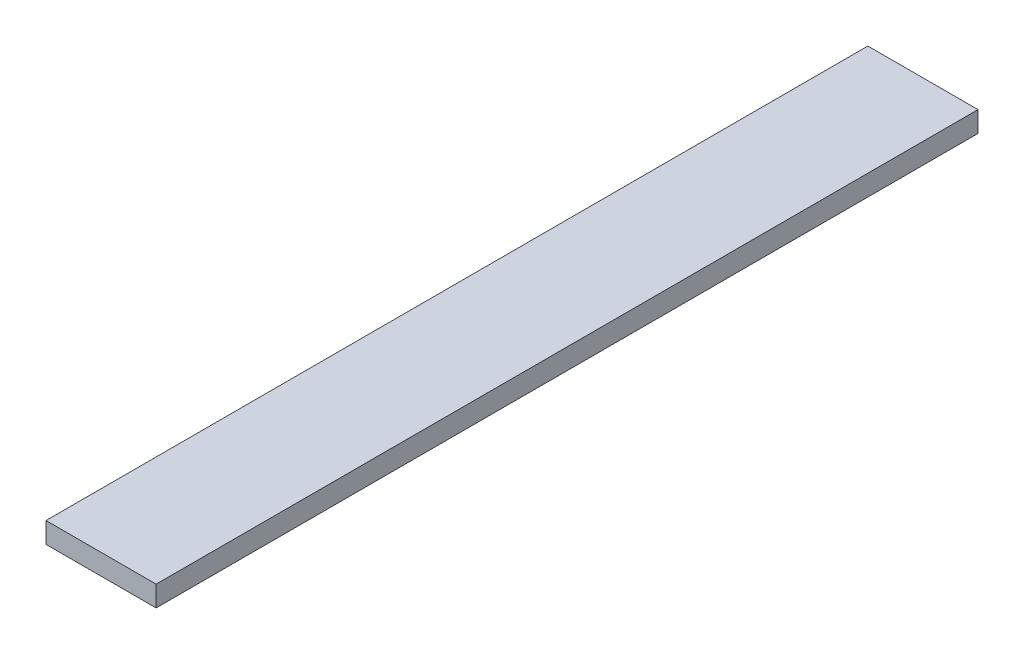
ISO-10303-21;
HEADER;
FILE_DESCRIPTION(('STEP AP214'),'2;1');
FILE_NAME('part.step','',(''),(''),'','','');
FILE_SCHEMA(('AUTOMOTIVE_DESIGN { 1 0 10303 214 1 1 1 1 }'));
ENDSEC;
DATA;
#1=APPLICATION_CONTEXT('core data for automotive mechanical design processes');
#2=APPLICATION_PROTOCOL_DEFINITION('international standard','automotive_design',2000,#1);
#3=PRODUCT_CONTEXT('',#1,'mechanical');
#4=PRODUCT('Part','Part','',(#3));
#5=PRODUCT_RELATED_PRODUCT_CATEGORY('part','',(#4));
#6=PRODUCT_DEFINITION_FORMATION('','',#4);
#7=PRODUCT_DEFINITION_CONTEXT('part definition',#1,'design');
#8=PRODUCT_DEFINITION('design','',#6,#7);
#9=PRODUCT_DEFINITION_SHAPE('','',#8);
#10=(LENGTH_UNIT() NAMED_UNIT(*) SI_UNIT(.MILLI.,.METRE.));
#11=(NAMED_UNIT(*) PLANE_ANGLE_UNIT() SI_UNIT($,.RADIAN.));
#12=(NAMED_UNIT(*) SI_UNIT($,.STERADIAN.) SOLID_ANGLE_UNIT());
#13=UNCERTAINTY_MEASURE_WITH_UNIT(LENGTH_MEASURE(1.E-05),#10,'distance_accuracy_value','');
#14=(GEOMETRIC_REPRESENTATION_CONTEXT(3) GLOBAL_UNCERTAINTY_ASSIGNED_CONTEXT((#13)) GLOBAL_UNIT_ASSIGNED_CONTEXT((#10,
#11,#12)) REPRESENTATION_CONTEXT('',''));
#15=CARTESIAN_POINT('',(0.,0.,0.));
#16=DIRECTION('',(0.,0.,1.));
#17=DIRECTION('',(1.,0.,0.));
#18=AXIS2_PLACEMENT_3D('',#15,#16,#17);
#19=CARTESIAN_POINT('',(0.,19.05,0.));
#20=DIRECTION('',(1.,0.,0.));
#21=DIRECTION('',(0.,0.,-1.));
#22=AXIS2_PLACEMENT_3D('',#19,#20,#21);
#23=PLANE('',#22);
#24=DIRECTION('',(0.,0.,1.));
#25=VECTOR('',#24,1.);
#26=CARTESIAN_POINT('',(0.,0.,0.));
#27=LINE('',#26,#25);
#28=CARTESIAN_POINT('',(0.,0.,0.));
#29=VERTEX_POINT('',#28);
#30=CARTESIAN_POINT('',(0.,0.,758.19));
#31=VERTEX_POINT('',#30);
#32=EDGE_CURVE('E96',#29,#31,#27,.T.);
#33=ORIENTED_EDGE('',*,*,#32,.T.);
#34=DIRECTION('',(0.,-1.,0.));
#35=VECTOR('',#34,1.);
#36=CARTESIAN_POINT('',(0.,19.05,758.19));
#37=LINE('',#36,#35);
#38=CARTESIAN_POINT('',(0.,19.05,758.19));
#39=VERTEX_POINT('',#38);
#40=EDGE_CURVE('E11',#39,#31,#37,.T.);
#41=ORIENTED_EDGE('',*,*,#40,.F.);
#42=DIRECTION('',(0.,0.,1.));
#43=VECTOR('',#42,1.);
#44=CARTESIAN_POINT('',(0.,19.05,0.));
#45=LINE('',#44,#43);
#46=CARTESIAN_POINT('',(0.,19.05,0.));
#47=VERTEX_POINT('',#46);
#48=EDGE_CURVE('E84',#47,#39,#45,.T.);
#49=ORIENTED_EDGE('',*,*,#48,.F.);
#50=DIRECTION('',(0.,-1.,0.));
#51=VECTOR('',#50,1.);
#52=CARTESIAN_POINT('',(0.,19.05,0.));
#53=LINE('',#52,#51);
#54=EDGE_CURVE('E92',#47,#29,#53,.T.);
#55=ORIENTED_EDGE('',*,*,#54,.T.);
#56=EDGE_LOOP('',(#33,#41,#49,#55));
#57=FACE_BOUND('',#56,.T.);
#58=ADVANCED_FACE('F33',(#57),#23,.F.);
#59=CARTESIAN_POINT('',(0.,19.05,758.19));
#60=DIRECTION('',(0.,0.,-1.));
#61=DIRECTION('',(-1.,0.,0.));
#62=AXIS2_PLACEMENT_3D('',#59,#60,#61);
#63=PLANE('',#62);
#64=DIRECTION('',(1.,0.,0.));
#65=VECTOR('',#64,1.);
#66=CARTESIAN_POINT('',(0.,0.,758.19));
#67=LINE('',#66,#65);
#68=CARTESIAN_POINT('',(101.6,0.,758.19));
#69=VERTEX_POINT('',#68);
#70=EDGE_CURVE('E88',#31,#69,#67,.T.);
#71=ORIENTED_EDGE('',*,*,#70,.T.);
#72=DIRECTION('',(0.,-1.,0.));
#73=VECTOR('',#72,1.);
#74=CARTESIAN_POINT('',(101.6,19.05,758.19));
#75=LINE('',#74,#73);
#76=CARTESIAN_POINT('',(101.6,19.05,758.19));
#77=VERTEX_POINT('',#76);
#78=EDGE_CURVE('E41',#77,#69,#75,.T.);
#79=ORIENTED_EDGE('',*,*,#78,.F.);
#80=DIRECTION('',(1.,0.,0.));
#81=VECTOR('',#80,1.);
#82=CARTESIAN_POINT('',(0.,19.05,758.19));
#83=LINE('',#82,#81);
#84=EDGE_CURVE('E79',#39,#77,#83,.T.);
#85=ORIENTED_EDGE('',*,*,#84,.F.);
#86=ORIENTED_EDGE('',*,*,#40,.T.);
#87=EDGE_LOOP('',(#71,#79,#85,#86));
#88=FACE_BOUND('',#87,.T.);
#89=ADVANCED_FACE('F87',(#88),#63,.F.);
#90=CARTESIAN_POINT('',(101.6,19.05,0.));
#91=DIRECTION('',(-1.,0.,0.));
#92=DIRECTION('',(0.,0.,1.));
#93=AXIS2_PLACEMENT_3D('',#90,#91,#92);
#94=PLANE('',#93);
#95=DIRECTION('',(0.,0.,-1.));
#96=VECTOR('',#95,1.);
#97=CARTESIAN_POINT('',(101.6,0.,0.));
#98=LINE('',#97,#96);
#99=CARTESIAN_POINT('',(101.6,0.,0.));
#100=VERTEX_POINT('',#99);
#101=EDGE_CURVE('E66',#69,#100,#98,.T.);
#102=ORIENTED_EDGE('',*,*,#101,.T.);
#103=DIRECTION('',(0.,-1.,0.));
#104=VECTOR('',#103,1.);
#105=CARTESIAN_POINT('',(101.6,19.05,0.));
#106=LINE('',#105,#104);
#107=CARTESIAN_POINT('',(101.6,19.05,0.));
#108=VERTEX_POINT('',#107);
#109=EDGE_CURVE('E89',#108,#100,#106,.T.);
#110=ORIENTED_EDGE('',*,*,#109,.F.);
#111=DIRECTION('',(0.,0.,-1.));
#112=VECTOR('',#111,1.);
#113=CARTESIAN_POINT('',(101.6,19.05,0.));
#114=LINE('',#113,#112);
#115=EDGE_CURVE('E82',#77,#108,#114,.T.);
#116=ORIENTED_EDGE('',*,*,#115,.F.);
#117=ORIENTED_EDGE('',*,*,#78,.T.);
#118=EDGE_LOOP('',(#102,#110,#116,#117));
#119=FACE_BOUND('',#118,.T.);
#120=ADVANCED_FACE('F90',(#119),#94,.F.);
#121=CARTESIAN_POINT('',(0.,19.05,0.));
#122=DIRECTION('',(0.,0.,1.));
#123=DIRECTION('',(1.,0.,0.));
#124=AXIS2_PLACEMENT_3D('',#121,#122,#123);
#125=PLANE('',#124);
#126=DIRECTION('',(-1.,0.,0.));
#127=VECTOR('',#126,1.);
#128=CARTESIAN_POINT('',(0.,0.,0.));
#129=LINE('',#128,#127);
#130=EDGE_CURVE('E72',#100,#29,#129,.T.);
#131=ORIENTED_EDGE('',*,*,#130,.T.);
#132=ORIENTED_EDGE('',*,*,#54,.F.);
#133=DIRECTION('',(-1.,0.,0.));
#134=VECTOR('',#133,1.);
#135=CARTESIAN_POINT('',(0.,19.05,0.));
#136=LINE('',#135,#134);
#137=EDGE_CURVE('E49',#108,#47,#136,.T.);
#138=ORIENTED_EDGE('',*,*,#137,.F.);
#139=ORIENTED_EDGE('',*,*,#109,.T.);
#140=EDGE_LOOP('',(#131,#132,#138,#139));
#141=FACE_BOUND('',#140,.T.);
#142=ADVANCED_FACE('F103',(#141),#125,.F.);
#143=CARTESIAN_POINT('',(0.,19.05,0.));
#144=DIRECTION('',(0.,1.,0.));
#145=DIRECTION('',(0.,0.,1.));
#146=AXIS2_PLACEMENT_3D('',#143,#144,#145);
#147=PLANE('',#146);
#148=ORIENTED_EDGE('',*,*,#48,.T.);
#149=ORIENTED_EDGE('',*,*,#84,.T.);
#150=ORIENTED_EDGE('',*,*,#115,.T.);
#151=ORIENTED_EDGE('',*,*,#137,.T.);
#152=EDGE_LOOP('',(#148,#149,#150,#151));
#153=FACE_BOUND('',#152,.T.);
#154=ADVANCED_FACE('F80',(#153),#147,.T.);
#155=CARTESIAN_POINT('',(0.,0.,0.));
#156=DIRECTION('',(0.,1.,0.));
#157=DIRECTION('',(0.,0.,1.));
#158=AXIS2_PLACEMENT_3D('',#155,#156,#157);
#159=PLANE('',#158);
#160=ORIENTED_EDGE('',*,*,#32,.F.);
#161=ORIENTED_EDGE('',*,*,#130,.F.);
#162=ORIENTED_EDGE('',*,*,#101,.F.);
#163=ORIENTED_EDGE('',*,*,#70,.F.);
#164=EDGE_LOOP('',(#160,#161,#162,#163));
#165=FACE_BOUND('',#164,.T.);
#166=ADVANCED_FACE('F106',(#165),#159,.F.);
#167=CLOSED_SHELL('',(#58,#89,#120,#142,#154,#166));
#168=MANIFOLD_SOLID_BREP('B2',#167);
#169=ADVANCED_BREP_SHAPE_REPRESENTATION('',(#18,#168),#14);
#170=SHAPE_DEFINITION_REPRESENTATION(#9,#169);
ENDSEC;
END-ISO-10303-21;
